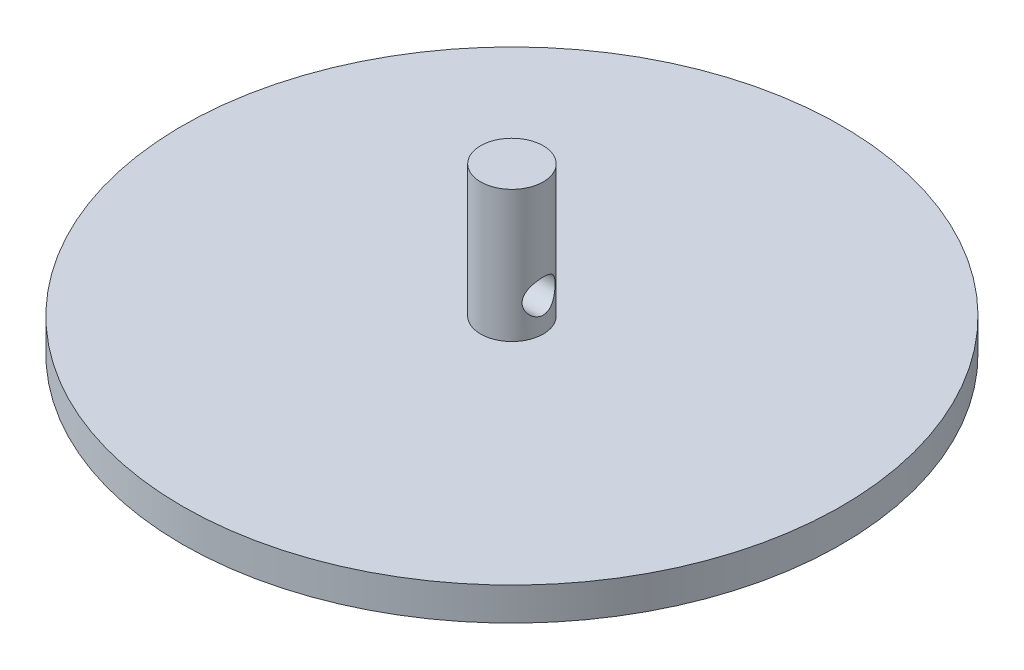
ISO-10303-21;
HEADER;
FILE_DESCRIPTION(('STEP AP214'),'2;1');
FILE_NAME('part.step','',(''),(''),'','','');
FILE_SCHEMA(('AUTOMOTIVE_DESIGN { 1 0 10303 214 1 1 1 1 }'));
ENDSEC;
DATA;
#1=APPLICATION_CONTEXT('core data for automotive mechanical design processes');
#2=APPLICATION_PROTOCOL_DEFINITION('international standard','automotive_design',2000,#1);
#3=PRODUCT_CONTEXT('',#1,'mechanical');
#4=PRODUCT('Part','Part','',(#3));
#5=PRODUCT_RELATED_PRODUCT_CATEGORY('part','',(#4));
#6=PRODUCT_DEFINITION_FORMATION('','',#4);
#7=PRODUCT_DEFINITION_CONTEXT('part definition',#1,'design');
#8=PRODUCT_DEFINITION('design','',#6,#7);
#9=PRODUCT_DEFINITION_SHAPE('','',#8);
#10=(LENGTH_UNIT() NAMED_UNIT(*) SI_UNIT(.MILLI.,.METRE.));
#11=(NAMED_UNIT(*) PLANE_ANGLE_UNIT() SI_UNIT($,.RADIAN.));
#12=(NAMED_UNIT(*) SI_UNIT($,.STERADIAN.) SOLID_ANGLE_UNIT());
#13=UNCERTAINTY_MEASURE_WITH_UNIT(LENGTH_MEASURE(1.E-05),#10,'distance_accuracy_value','');
#14=(GEOMETRIC_REPRESENTATION_CONTEXT(3) GLOBAL_UNCERTAINTY_ASSIGNED_CONTEXT((#13)) GLOBAL_UNIT_ASSIGNED_CONTEXT((#10,
#11,#12)) REPRESENTATION_CONTEXT('',''));
#15=CARTESIAN_POINT('',(0.,0.,0.));
#16=DIRECTION('',(0.,0.,1.));
#17=DIRECTION('',(1.,0.,0.));
#18=AXIS2_PLACEMENT_3D('',#15,#16,#17);
#19=CARTESIAN_POINT('',(0.,4.99999999999999,0.));
#20=DIRECTION('',(0.,-1.,0.));
#21=DIRECTION('',(0.,0.,-1.));
#22=AXIS2_PLACEMENT_3D('',#19,#20,#21);
#23=CYLINDRICAL_SURFACE('',#22,50.);
#24=CARTESIAN_POINT('',(0.,4.99999999999999,0.));
#25=DIRECTION('',(0.,1.,0.));
#26=DIRECTION('',(0.,0.,1.));
#27=AXIS2_PLACEMENT_3D('',#24,#25,#26);
#28=CIRCLE('',#27,50.);
#29=CARTESIAN_POINT('',(0.,4.99999999999999,50.));
#30=VERTEX_POINT('',#29);
#31=EDGE_CURVE('E10',#30,#30,#28,.T.);
#32=ORIENTED_EDGE('',*,*,#31,.F.);
#33=EDGE_LOOP('',(#32));
#34=FACE_BOUND('',#33,.T.);
#35=CARTESIAN_POINT('',(0.,0.,0.));
#36=DIRECTION('',(0.,1.,0.));
#37=DIRECTION('',(0.,0.,1.));
#38=AXIS2_PLACEMENT_3D('',#35,#36,#37);
#39=CIRCLE('',#38,50.);
#40=CARTESIAN_POINT('',(0.,0.,50.));
#41=VERTEX_POINT('',#40);
#42=EDGE_CURVE('E33',#41,#41,#39,.T.);
#43=ORIENTED_EDGE('',*,*,#42,.T.);
#44=EDGE_LOOP('',(#43));
#45=FACE_BOUND('',#44,.T.);
#46=ADVANCED_FACE('F30',(#34,#45),#23,.T.);
#47=CARTESIAN_POINT('',(0.,4.99999999999999,0.));
#48=DIRECTION('',(0.,1.,0.));
#49=DIRECTION('',(0.,0.,1.));
#50=AXIS2_PLACEMENT_3D('',#47,#48,#49);
#51=PLANE('',#50);
#52=CARTESIAN_POINT('',(0.,4.99999999999999,0.));
#53=DIRECTION('',(0.,1.,0.));
#54=DIRECTION('',(0.,0.,1.));
#55=AXIS2_PLACEMENT_3D('',#52,#53,#54);
#56=CIRCLE('',#55,4.75);
#57=CARTESIAN_POINT('',(0.,4.99999999999999,4.75));
#58=VERTEX_POINT('',#57);
#59=EDGE_CURVE('E42',#58,#58,#56,.T.);
#60=ORIENTED_EDGE('',*,*,#59,.F.);
#61=EDGE_LOOP('',(#60));
#62=FACE_BOUND('',#61,.T.);
#63=ORIENTED_EDGE('',*,*,#31,.T.);
#64=EDGE_LOOP('',(#63));
#65=FACE_BOUND('',#64,.T.);
#66=ADVANCED_FACE('F76',(#62,#65),#51,.T.);
#67=CARTESIAN_POINT('',(0.,0.,0.));
#68=DIRECTION('',(0.,1.,0.));
#69=DIRECTION('',(0.,0.,1.));
#70=AXIS2_PLACEMENT_3D('',#67,#68,#69);
#71=PLANE('',#70);
#72=ORIENTED_EDGE('',*,*,#42,.F.);
#73=EDGE_LOOP('',(#72));
#74=FACE_BOUND('',#73,.T.);
#75=ADVANCED_FACE('F74',(#74),#71,.F.);
#76=CARTESIAN_POINT('',(0.,25.,0.));
#77=DIRECTION('',(0.,-1.,0.));
#78=DIRECTION('',(0.,0.,-1.));
#79=AXIS2_PLACEMENT_3D('',#76,#77,#78);
#80=CYLINDRICAL_SURFACE('',#79,4.75);
#81=CARTESIAN_POINT('',(-4.03887360535088,9.99999999999999,-2.5));
#82=CARTESIAN_POINT('',(-4.03888812531015,9.87083262946928,-2.49998867061103));
#83=CARTESIAN_POINT('',(-4.04516698254278,9.74152162315368,-2.48992023762239));
#84=CARTESIAN_POINT('',(-4.06934094337632,9.48696086523025,-2.45019726856165));
#85=CARTESIAN_POINT('',(-4.0872578636768,9.36171920595474,-2.42050594561415));
#86=CARTESIAN_POINT('',(-4.13203590171689,9.11946870188311,-2.34323316322505));
#87=CARTESIAN_POINT('',(-4.15884524430077,9.00241684218623,-2.29575506287283));
#88=CARTESIAN_POINT('',(-4.21830577650236,8.77797525687577,-2.18457313621343));
#89=CARTESIAN_POINT('',(-4.25095778831348,8.67058689433165,-2.1208670257294));
#90=CARTESIAN_POINT('',(-4.32208279255168,8.45763589567024,-1.97217898099827));
#91=CARTESIAN_POINT('',(-4.36081495564558,8.3531493391016,-1.88577924364374));
#92=CARTESIAN_POINT('',(-4.43765175363116,8.15929902208035,-1.69709440427975));
#93=CARTESIAN_POINT('',(-4.47575603470986,8.06994354154089,-1.59480066320226));
#94=CARTESIAN_POINT('',(-4.55053297416448,7.90216311336722,-1.36766138576738));
#95=CARTESIAN_POINT('',(-4.58687169822686,7.82510208945648,-1.2416879420103));
#96=CARTESIAN_POINT('',(-4.65058284555815,7.69376340751659,-0.976291684884847));
#97=CARTESIAN_POINT('',(-4.67796152606865,7.63946984235784,-0.836878345719098));
#98=CARTESIAN_POINT('',(-4.71878653801522,7.55960499458841,-0.559994041985742));
#99=CARTESIAN_POINT('',(-4.73314764131348,7.53213497177431,-0.423208795194145));
#100=CARTESIAN_POINT('',(-4.74976768616209,7.5004025885769,-0.14627953317494));
#101=CARTESIAN_POINT('',(-4.75203488067485,7.49612440190065,-0.00613787400064228));
#102=CARTESIAN_POINT('',(-4.74460623650499,7.51026004814805,0.259076338353163));
#103=CARTESIAN_POINT('',(-4.73603922108799,7.52653247205053,0.38430267781477));
#104=CARTESIAN_POINT('',(-4.70966402753069,7.57741709315143,0.629940951933744));
#105=CARTESIAN_POINT('',(-4.69185514990776,7.61203067852922,0.750352521435766));
#106=CARTESIAN_POINT('',(-4.64832397441338,7.69873205120478,0.984887089559891));
#107=CARTESIAN_POINT('',(-4.62250593705632,7.75103197780767,1.09891315894851));
#108=CARTESIAN_POINT('',(-4.56521547269153,7.87127174439348,1.31682178309576));
#109=CARTESIAN_POINT('',(-4.53374111645664,7.93921692280675,1.42070085825399));
#110=CARTESIAN_POINT('',(-4.46424376584011,8.09672207531675,1.62665505242781));
#111=CARTESIAN_POINT('',(-4.4258803091989,8.18777760790389,1.7274720542153));
#112=CARTESIAN_POINT('',(-4.3488611579074,8.38496579334067,1.91312023852326));
#113=CARTESIAN_POINT('',(-4.31020522968356,8.49111205114304,1.99793683364331));
#114=CARTESIAN_POINT('',(-4.23372124303907,8.7252315012338,2.15553900494873));
#115=CARTESIAN_POINT('',(-4.19617792245355,8.85424919596151,2.22692574246733));
#116=CARTESIAN_POINT('',(-4.13053185640884,9.12483616961873,2.34646513983195));
#117=CARTESIAN_POINT('',(-4.10241855368041,9.26639118649915,2.39464380854862));
#118=CARTESIAN_POINT('',(-4.0621422867193,9.54609176094181,2.46230513109403));
#119=CARTESIAN_POINT('',(-4.04887181048388,9.68358476628825,2.48379603615209));
#120=CARTESIAN_POINT('',(-4.03669887929133,9.96081221528759,2.50354258963319));
#121=CARTESIAN_POINT('',(-4.0377834103426,10.1005445140433,2.50181928361765));
#122=CARTESIAN_POINT('',(-4.05301938987821,10.3592088443278,2.47702872720832));
#123=CARTESIAN_POINT('',(-4.06548746067276,10.4785217031213,2.45671037945484));
#124=CARTESIAN_POINT('',(-4.09948530376419,10.7117640801188,2.39954535503814));
#125=CARTESIAN_POINT('',(-4.12101847560686,10.8256915608805,2.36269247734256));
#126=CARTESIAN_POINT('',(-4.17182553387233,11.0508178618131,2.27182388618019));
#127=CARTESIAN_POINT('',(-4.20140382363248,11.1616639137971,2.21711124559024));
#128=CARTESIAN_POINT('',(-4.26475454469484,11.3732596619006,2.09266397844078));
#129=CARTESIAN_POINT('',(-4.29852912048535,11.4740041477563,2.02292165756508));
#130=CARTESIAN_POINT('',(-4.37224571131928,11.677582451844,1.85880518086639));
#131=CARTESIAN_POINT('',(-4.41238048517128,11.7786662080914,1.76233682807779));
#132=CARTESIAN_POINT('',(-4.49022284586623,11.9638391100209,1.55333112088788));
#133=CARTESIAN_POINT('',(-4.52792930975367,12.0479204309605,1.44078640840824));
#134=CARTESIAN_POINT('',(-4.59846981780749,12.1995691398422,1.19717863324112));
#135=CARTESIAN_POINT('',(-4.63106381820085,12.2663862717116,1.06557381696695));
#136=CARTESIAN_POINT('',(-4.68579907248276,12.3762351954693,0.790784449187746));
#137=CARTESIAN_POINT('',(-4.70795042753708,12.4192899795782,0.647611245502355));
#138=CARTESIAN_POINT('',(-4.73753030450787,12.4763319799001,0.36880213332756));
#139=CARTESIAN_POINT('',(-4.74618361967145,12.4927437824936,0.233792169873114));
#140=CARTESIAN_POINT('',(-4.75178452816457,12.5033946193281,-0.0373205703025252));
#141=CARTESIAN_POINT('',(-4.74873720505037,12.4976432827462,-0.173422846805671));
#142=CARTESIAN_POINT('',(-4.73197968872814,12.4656214126251,-0.431647650566602));
#143=CARTESIAN_POINT('',(-4.71911732530864,12.4409817259992,-0.554034117484782));
#144=CARTESIAN_POINT('',(-4.68494300218834,12.3742390002488,-0.792683878015559));
#145=CARTESIAN_POINT('',(-4.66362994502346,12.3321336928882,-0.908946374105541));
#146=CARTESIAN_POINT('',(-4.61340184769059,12.2300282485852,-1.13719680020039));
#147=CARTESIAN_POINT('',(-4.58422279183363,12.1693943648968,-1.2488412868035));
#148=CARTESIAN_POINT('',(-4.52115438909754,12.0327352860642,-1.46079086790188));
#149=CARTESIAN_POINT('',(-4.48726297217146,11.9567033201095,-1.56109094371546));
#150=CARTESIAN_POINT('',(-4.41370181596798,11.7819113824138,-1.75899072253612));
#151=CARTESIAN_POINT('',(-4.37380365233274,11.6815823037625,-1.85512377023802));
#152=CARTESIAN_POINT('',(-4.29551859977349,11.4659799846094,-2.02982818840288));
#153=CARTESIAN_POINT('',(-4.25713334209703,11.3506911594581,-2.10838100842529));
#154=CARTESIAN_POINT('',(-4.1845013890379,11.1010877494758,-2.24923532456028));
#155=CARTESIAN_POINT('',(-4.15054906415644,10.9661182810389,-2.31055366516208));
#156=CARTESIAN_POINT('',(-4.10841467098213,10.7558464653633,-2.38415996754678));
#157=CARTESIAN_POINT('',(-4.09584271205872,10.6845186529915,-2.40562277808253));
#158=CARTESIAN_POINT('',(-4.07415373094539,10.5397533319464,-2.4421765290806));
#159=CARTESIAN_POINT('',(-4.06503439271286,10.466317273201,-2.4572717417518));
#160=CARTESIAN_POINT('',(-4.05162249701516,10.3275397525283,-2.47931450810892));
#161=CARTESIAN_POINT('',(-4.04686058993726,10.2623693816134,-2.48705924561603));
#162=CARTESIAN_POINT('',(-4.04048236686001,10.1314784347929,-2.49740500828099));
#163=CARTESIAN_POINT('',(-4.03886621338324,10.0657578306363,-2.50000576767986));
#164=CARTESIAN_POINT('',(-4.03887360535088,9.99999999999999,-2.5));
#165=B_SPLINE_CURVE_WITH_KNOTS('',3,(#81,#82,#83,#84,#85,#86,#87,#88,#89,#90,#91,#92,#93,#94,
#95,#96,#97,#98,#99,#100,#101,#102,#103,#104,#105,#106,#107,#108,#109,#110,#111,#112,#113,#114,
#115,#116,#117,#118,#119,#120,#121,#122,#123,#124,#125,#126,#127,#128,#129,#130,#131,#132,#133,
#134,#135,#136,#137,#138,#139,#140,#141,#142,#143,#144,#145,#146,#147,#148,#149,#150,#151,#152,
#153,#154,#155,#156,#157,#158,#159,#160,#161,#162,#163,#164),.UNSPECIFIED.,.T.,.F.,(4,2,2,2,2,2,
2,2,2,2,2,2,2,2,2,2,2,2,2,2,2,2,2,2,2,2,2,2,2,2,2,2,2,2,2,2,2,2,2,2,2,4),(0.,0.387234285843366,
0.775196583781342,1.1609385444098,1.54673483025626,1.96800967299552,2.38951430279642,
2.84334634263266,3.29686076942274,3.71525319409777,4.13336006848834,4.51128274484776,
4.88923402896023,5.2718896845539,5.6546761028652,6.07639598982795,6.49849851562591,
6.95258898105678,7.40616936455845,7.82301029566158,8.23947335217174,8.60284625447546,
8.96635554850576,9.34620245901311,9.72624429281511,10.1604713308364,10.5948977532658,
11.0458572820446,11.4963796982681,11.9029807979992,12.3094052624409,12.6842167082229,
13.059076845498,13.4485537204451,13.8382022286023,14.2700145035632,14.7022802954882,
15.1556952526836,15.3820075810448,15.6081678273627,15.805294787712,16.0024319321815),.UNSPECIFIED.);
#166=CARTESIAN_POINT('',(-4.03887360535088,9.99999999999999,-2.5));
#167=VERTEX_POINT('',#166);
#168=EDGE_CURVE('E45',#167,#167,#165,.T.);
#169=ORIENTED_EDGE('',*,*,#168,.F.);
#170=EDGE_LOOP('',(#169));
#171=FACE_BOUND('',#170,.T.);
#172=CARTESIAN_POINT('',(4.03887360535088,9.99999999999999,-2.5));
#173=CARTESIAN_POINT('',(4.03888812531015,10.1291673705307,-2.49998867061103));
#174=CARTESIAN_POINT('',(4.04516698254278,10.2584783768463,-2.48992023762239));
#175=CARTESIAN_POINT('',(4.06934094337632,10.5130391347697,-2.45019726856165));
#176=CARTESIAN_POINT('',(4.0872578636768,10.6382807940452,-2.42050594561415));
#177=CARTESIAN_POINT('',(4.13203590171689,10.8805312981169,-2.34323316322505));
#178=CARTESIAN_POINT('',(4.15884524430077,10.9975831578138,-2.29575506287283));
#179=CARTESIAN_POINT('',(4.21830577650236,11.2220247431242,-2.18457313621343));
#180=CARTESIAN_POINT('',(4.25095778831348,11.3294131056683,-2.1208670257294));
#181=CARTESIAN_POINT('',(4.32208279255168,11.5423641043297,-1.97217898099827));
#182=CARTESIAN_POINT('',(4.36081495564558,11.6468506608984,-1.88577924364374));
#183=CARTESIAN_POINT('',(4.43765175363116,11.8407009779196,-1.69709440427975));
#184=CARTESIAN_POINT('',(4.47575603470986,11.9300564584591,-1.59480066320226));
#185=CARTESIAN_POINT('',(4.55053297416448,12.0978368866328,-1.36766138576738));
#186=CARTESIAN_POINT('',(4.58687169822686,12.1748979105435,-1.2416879420103));
#187=CARTESIAN_POINT('',(4.65058284555815,12.3062365924834,-0.976291684884847));
#188=CARTESIAN_POINT('',(4.67796152606865,12.3605301576421,-0.836878345719099));
#189=CARTESIAN_POINT('',(4.71878653801522,12.4403950054116,-0.559994041985742));
#190=CARTESIAN_POINT('',(4.73314764131348,12.4678650282257,-0.423208795194145));
#191=CARTESIAN_POINT('',(4.74976768616209,12.4995974114231,-0.14627953317494));
#192=CARTESIAN_POINT('',(4.75203488067485,12.5038755980993,-0.00613787400064231));
#193=CARTESIAN_POINT('',(4.74460623650499,12.4897399518519,0.259076338353164));
#194=CARTESIAN_POINT('',(4.73603922108799,12.4734675279495,0.384302677814771));
#195=CARTESIAN_POINT('',(4.70966402753069,12.4225829068486,0.629940951933744));
#196=CARTESIAN_POINT('',(4.69185514990776,12.3879693214708,0.750352521435766));
#197=CARTESIAN_POINT('',(4.64832397441338,12.3012679487952,0.984887089559892));
#198=CARTESIAN_POINT('',(4.62250593705633,12.2489680221923,1.09891315894852));
#199=CARTESIAN_POINT('',(4.56521547269153,12.1287282556065,1.31682178309576));
#200=CARTESIAN_POINT('',(4.53374111645664,12.0607830771932,1.42070085825399));
#201=CARTESIAN_POINT('',(4.46424376584011,11.9032779246832,1.62665505242781));
#202=CARTESIAN_POINT('',(4.4258803091989,11.8122223920961,1.7274720542153));
#203=CARTESIAN_POINT('',(4.3488611579074,11.6150342066593,1.91312023852326));
#204=CARTESIAN_POINT('',(4.31020522968356,11.5088879488569,1.99793683364331));
#205=CARTESIAN_POINT('',(4.23372124303907,11.2747684987662,2.15553900494873));
#206=CARTESIAN_POINT('',(4.19617792245355,11.1457508040385,2.22692574246733));
#207=CARTESIAN_POINT('',(4.13053185640884,10.8751638303813,2.34646513983195));
#208=CARTESIAN_POINT('',(4.10241855368041,10.7336088135008,2.39464380854862));
#209=CARTESIAN_POINT('',(4.0621422867193,10.4539082390582,2.46230513109403));
#210=CARTESIAN_POINT('',(4.04887181048388,10.3164152337117,2.48379603615209));
#211=CARTESIAN_POINT('',(4.03669887929133,10.0391877847124,2.50354258963319));
#212=CARTESIAN_POINT('',(4.0377834103426,9.89945548595665,2.50181928361765));
#213=CARTESIAN_POINT('',(4.05301938987821,9.64079115567219,2.47702872720832));
#214=CARTESIAN_POINT('',(4.06548746067276,9.52147829687866,2.45671037945484));
#215=CARTESIAN_POINT('',(4.09948530376419,9.28823591988123,2.39954535503814));
#216=CARTESIAN_POINT('',(4.12101847560686,9.17430843911952,2.36269247734256));
#217=CARTESIAN_POINT('',(4.17182553387233,8.94918213818693,2.27182388618019));
#218=CARTESIAN_POINT('',(4.20140382363248,8.83833608620291,2.21711124559024));
#219=CARTESIAN_POINT('',(4.26475454469485,8.6267403380994,2.09266397844078));
#220=CARTESIAN_POINT('',(4.29852912048535,8.52599585224366,2.02292165756508));
#221=CARTESIAN_POINT('',(4.37224571131928,8.32241754815596,1.85880518086639));
#222=CARTESIAN_POINT('',(4.41238048517128,8.22133379190855,1.76233682807779));
#223=CARTESIAN_POINT('',(4.49022284586623,8.03616088997909,1.55333112088788));
#224=CARTESIAN_POINT('',(4.52792930975367,7.95207956903948,1.44078640840824));
#225=CARTESIAN_POINT('',(4.59846981780749,7.80043086015775,1.19717863324112));
#226=CARTESIAN_POINT('',(4.63106381820085,7.73361372828841,1.06557381696695));
#227=CARTESIAN_POINT('',(4.68579907248276,7.6237648045307,0.790784449187747));
#228=CARTESIAN_POINT('',(4.70795042753708,7.5807100204218,0.647611245502356));
#229=CARTESIAN_POINT('',(4.73753030450787,7.52366802009985,0.36880213332756));
#230=CARTESIAN_POINT('',(4.74618361967145,7.50725621750639,0.233792169873113));
#231=CARTESIAN_POINT('',(4.75178452816457,7.49660538067191,-0.0373205703025255));
#232=CARTESIAN_POINT('',(4.74873720505037,7.50235671725375,-0.173422846805671));
#233=CARTESIAN_POINT('',(4.73197968872814,7.53437858737493,-0.431647650566601));
#234=CARTESIAN_POINT('',(4.71911732530864,7.5590182740008,-0.554034117484781));
#235=CARTESIAN_POINT('',(4.68494300218834,7.6257609997512,-0.792683878015557));
#236=CARTESIAN_POINT('',(4.66362994502346,7.66786630711182,-0.90894637410554));
#237=CARTESIAN_POINT('',(4.61340184769059,7.76997175141477,-1.13719680020039));
#238=CARTESIAN_POINT('',(4.58422279183363,7.83060563510322,-1.2488412868035));
#239=CARTESIAN_POINT('',(4.52115438909754,7.96726471393576,-1.46079086790188));
#240=CARTESIAN_POINT('',(4.48726297217146,8.04329667989048,-1.56109094371546));
#241=CARTESIAN_POINT('',(4.41370181596798,8.21808861758621,-1.75899072253612));
#242=CARTESIAN_POINT('',(4.37380365233274,8.31841769623747,-1.85512377023802));
#243=CARTESIAN_POINT('',(4.29551859977349,8.53402001539061,-2.02982818840288));
#244=CARTESIAN_POINT('',(4.25713334209703,8.64930884054187,-2.10838100842529));
#245=CARTESIAN_POINT('',(4.1845013890379,8.89891225052424,-2.24923532456028));
#246=CARTESIAN_POINT('',(4.15054906415644,9.03388171896106,-2.31055366516208));
#247=CARTESIAN_POINT('',(4.10841467098213,9.24415353463672,-2.38415996754678));
#248=CARTESIAN_POINT('',(4.09584271205872,9.31548134700848,-2.40562277808253));
#249=CARTESIAN_POINT('',(4.07415373094539,9.4602466680536,-2.4421765290806));
#250=CARTESIAN_POINT('',(4.06503439271286,9.533682726799,-2.4572717417518));
#251=CARTESIAN_POINT('',(4.05162249701516,9.67246024747166,-2.47931450810892));
#252=CARTESIAN_POINT('',(4.04686058993726,9.73763061838663,-2.48705924561603));
#253=CARTESIAN_POINT('',(4.04048236686001,9.86852156520706,-2.49740500828099));
#254=CARTESIAN_POINT('',(4.03886621338324,9.93424216936369,-2.50000576767986));
#255=CARTESIAN_POINT('',(4.03887360535088,9.99999999999999,-2.5));
#256=B_SPLINE_CURVE_WITH_KNOTS('',3,(#172,#173,#174,#175,#176,#177,#178,#179,#180,#181,#182,
#183,#184,#185,#186,#187,#188,#189,#190,#191,#192,#193,#194,#195,#196,#197,#198,#199,#200,#201,
#202,#203,#204,#205,#206,#207,#208,#209,#210,#211,#212,#213,#214,#215,#216,#217,#218,#219,#220,
#221,#222,#223,#224,#225,#226,#227,#228,#229,#230,#231,#232,#233,#234,#235,#236,#237,#238,#239,
#240,#241,#242,#243,#244,#245,#246,#247,#248,#249,#250,#251,#252,#253,#254,#255),.UNSPECIFIED.,
.T.,.F.,(4,2,2,2,2,2,2,2,2,2,2,2,2,2,2,2,2,2,2,2,2,2,2,2,2,2,2,2,2,2,2,2,2,2,2,2,2,2,2,2,2,4),
(0.,0.387234285843362,0.775196583781342,1.1609385444098,1.54673483025626,1.96800967299551,
2.38951430279642,2.84334634263266,3.29686076942274,3.71525319409777,4.13336006848834,
4.51128274484776,4.88923402896023,5.2718896845539,5.6546761028652,6.07639598982795,
6.49849851562591,6.95258898105678,7.40616936455844,7.82301029566158,8.23947335217173,
8.60284625447546,8.96635554850576,9.34620245901311,9.72624429281511,10.1604713308364,
10.5948977532658,11.0458572820446,11.4963796982681,11.9029807979992,12.3094052624409,
12.6842167082228,13.059076845498,13.4485537204451,13.8382022286023,14.2700145035632,
14.7022802954882,15.1556952526835,15.3820075810448,15.6081678273627,15.805294787712,
16.0024319321815),.UNSPECIFIED.);
#257=CARTESIAN_POINT('',(4.03887360535088,9.99999999999999,-2.5));
#258=VERTEX_POINT('',#257);
#259=EDGE_CURVE('E55',#258,#258,#256,.T.);
#260=ORIENTED_EDGE('',*,*,#259,.F.);
#261=EDGE_LOOP('',(#260));
#262=FACE_BOUND('',#261,.T.);
#263=CARTESIAN_POINT('',(0.,25.,0.));
#264=DIRECTION('',(0.,1.,0.));
#265=DIRECTION('',(0.,0.,1.));
#266=AXIS2_PLACEMENT_3D('',#263,#264,#265);
#267=CIRCLE('',#266,4.75);
#268=CARTESIAN_POINT('',(0.,25.,4.75));
#269=VERTEX_POINT('',#268);
#270=EDGE_CURVE('E40',#269,#269,#267,.T.);
#271=ORIENTED_EDGE('',*,*,#270,.F.);
#272=EDGE_LOOP('',(#271));
#273=FACE_BOUND('',#272,.T.);
#274=ORIENTED_EDGE('',*,*,#59,.T.);
#275=EDGE_LOOP('',(#274));
#276=FACE_BOUND('',#275,.T.);
#277=ADVANCED_FACE('F70',(#171,#262,#273,#276),#80,.T.);
#278=CARTESIAN_POINT('',(0.,25.,0.));
#279=DIRECTION('',(0.,1.,0.));
#280=DIRECTION('',(0.,0.,1.));
#281=AXIS2_PLACEMENT_3D('',#278,#279,#280);
#282=PLANE('',#281);
#283=ORIENTED_EDGE('',*,*,#270,.T.);
#284=EDGE_LOOP('',(#283));
#285=FACE_BOUND('',#284,.T.);
#286=ADVANCED_FACE('F65',(#285),#282,.T.);
#287=CARTESIAN_POINT('',(-50.001,9.99999999999999,0.));
#288=DIRECTION('',(1.,0.,0.));
#289=DIRECTION('',(0.,0.,-1.));
#290=AXIS2_PLACEMENT_3D('',#287,#288,#289);
#291=CYLINDRICAL_SURFACE('',#290,2.5);
#292=ORIENTED_EDGE('',*,*,#259,.T.);
#293=EDGE_LOOP('',(#292));
#294=FACE_BOUND('',#293,.T.);
#295=ORIENTED_EDGE('',*,*,#168,.T.);
#296=EDGE_LOOP('',(#295));
#297=FACE_BOUND('',#296,.T.);
#298=ADVANCED_FACE('F59',(#294,#297),#291,.F.);
#299=CLOSED_SHELL('',(#46,#66,#75,#277,#286,#298));
#300=MANIFOLD_SOLID_BREP('B2',#299);
#301=ADVANCED_BREP_SHAPE_REPRESENTATION('',(#18,#300),#14);
#302=SHAPE_DEFINITION_REPRESENTATION(#9,#301);
ENDSEC;
END-ISO-10303-21;
